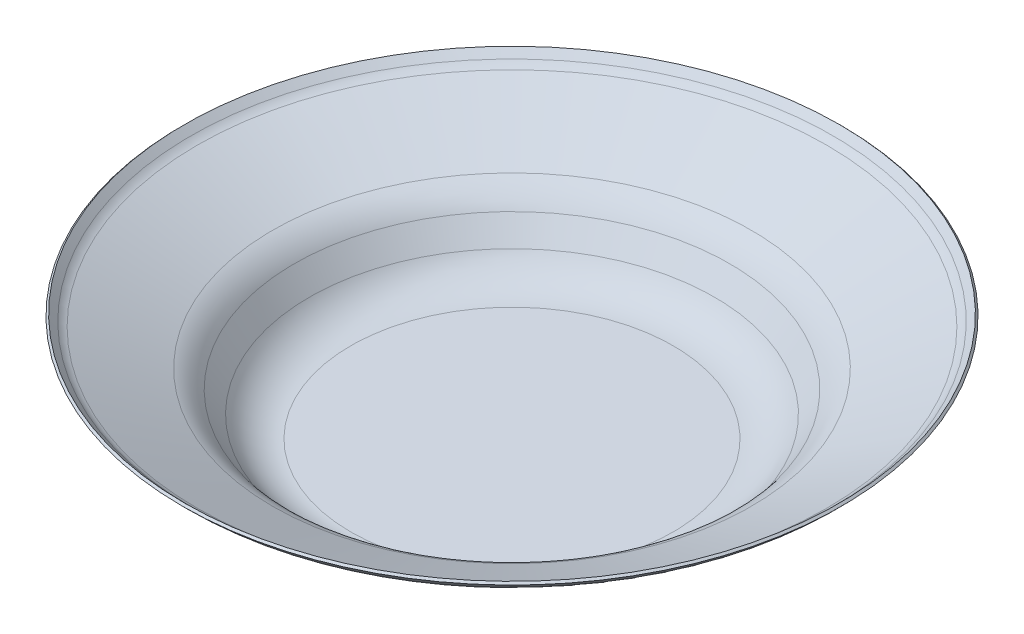
ISO-10303-21;
HEADER;
FILE_DESCRIPTION(('STEP AP214'),'2;1');
FILE_NAME('part.step','',(''),(''),'','','');
FILE_SCHEMA(('AUTOMOTIVE_DESIGN { 1 0 10303 214 1 1 1 1 }'));
ENDSEC;
DATA;
#1=APPLICATION_CONTEXT('core data for automotive mechanical design processes');
#2=APPLICATION_PROTOCOL_DEFINITION('international standard','automotive_design',2000,#1);
#3=PRODUCT_CONTEXT('',#1,'mechanical');
#4=PRODUCT('Part','Part','',(#3));
#5=PRODUCT_RELATED_PRODUCT_CATEGORY('part','',(#4));
#6=PRODUCT_DEFINITION_FORMATION('','',#4);
#7=PRODUCT_DEFINITION_CONTEXT('part definition',#1,'design');
#8=PRODUCT_DEFINITION('design','',#6,#7);
#9=PRODUCT_DEFINITION_SHAPE('','',#8);
#10=(LENGTH_UNIT() NAMED_UNIT(*) SI_UNIT(.MILLI.,.METRE.));
#11=(NAMED_UNIT(*) PLANE_ANGLE_UNIT() SI_UNIT($,.RADIAN.));
#12=(NAMED_UNIT(*) SI_UNIT($,.STERADIAN.) SOLID_ANGLE_UNIT());
#13=UNCERTAINTY_MEASURE_WITH_UNIT(LENGTH_MEASURE(1.E-05),#10,'distance_accuracy_value','');
#14=(GEOMETRIC_REPRESENTATION_CONTEXT(3) GLOBAL_UNCERTAINTY_ASSIGNED_CONTEXT((#13)) GLOBAL_UNIT_ASSIGNED_CONTEXT((#10,
#11,#12)) REPRESENTATION_CONTEXT('',''));
#15=CARTESIAN_POINT('',(0.,0.,0.));
#16=DIRECTION('',(0.,0.,1.));
#17=DIRECTION('',(1.,0.,0.));
#18=AXIS2_PLACEMENT_3D('',#15,#16,#17);
#19=CARTESIAN_POINT('',(0.,19.6440988052595,0.));
#20=DIRECTION('',(0.,1.,0.));
#21=DIRECTION('',(0.,0.,1.));
#22=AXIS2_PLACEMENT_3D('',#19,#20,#21);
#23=CONICAL_SURFACE('',#22,60.3915678494885,0.785398163397455);
#24=CARTESIAN_POINT('',(0.,20.8626191875281,0.));
#25=DIRECTION('',(0.,1.,0.));
#26=DIRECTION('',(0.,0.,1.));
#27=AXIS2_PLACEMENT_3D('',#24,#25,#26);
#28=CIRCLE('',#27,61.610088231757);
#29=CARTESIAN_POINT('',(0.,20.8626191875281,61.610088231757));
#30=VERTEX_POINT('',#29);
#31=EDGE_CURVE('E102',#30,#30,#28,.T.);
#32=ORIENTED_EDGE('',*,*,#31,.T.);
#33=EDGE_LOOP('',(#32));
#34=FACE_BOUND('',#33,.T.);
#35=CARTESIAN_POINT('',(0.,19.6440988052595,0.));
#36=DIRECTION('',(0.,1.,0.));
#37=DIRECTION('',(0.,0.,1.));
#38=AXIS2_PLACEMENT_3D('',#35,#36,#37);
#39=CIRCLE('',#38,60.3915678494885);
#40=CARTESIAN_POINT('',(0.,19.6440988052595,60.3915678494885));
#41=VERTEX_POINT('',#40);
#42=EDGE_CURVE('E10',#41,#41,#39,.T.);
#43=ORIENTED_EDGE('',*,*,#42,.F.);
#44=EDGE_LOOP('',(#43));
#45=FACE_BOUND('',#44,.T.);
#46=ADVANCED_FACE('F43',(#34,#45),#23,.F.);
#47=CARTESIAN_POINT('',(0.,22.826079320599,0.));
#48=DIRECTION('',(0.,1.,0.));
#49=DIRECTION('',(0.,0.,1.));
#50=AXIS2_PLACEMENT_3D('',#47,#48,#49);
#51=TOROIDAL_SURFACE('',#50,57.209587334149,4.5);
#52=ORIENTED_EDGE('',*,*,#42,.T.);
#53=EDGE_LOOP('',(#52));
#54=FACE_BOUND('',#53,.T.);
#55=CARTESIAN_POINT('',(0.,18.7664753232386,0.));
#56=DIRECTION('',(0.,1.,0.));
#57=DIRECTION('',(0.,0.,1.));
#58=AXIS2_PLACEMENT_3D('',#55,#56,#57);
#59=CIRCLE('',#58,59.151137072017);
#60=CARTESIAN_POINT('',(0.,18.7664753232386,59.151137072017));
#61=VERTEX_POINT('',#60);
#62=EDGE_CURVE('E50',#61,#61,#59,.T.);
#63=ORIENTED_EDGE('',*,*,#62,.F.);
#64=EDGE_LOOP('',(#63));
#65=FACE_BOUND('',#64,.T.);
#66=ADVANCED_FACE('F162',(#54,#65),#51,.F.);
#67=CARTESIAN_POINT('',(0.,11.991833453862,0.));
#68=DIRECTION('',(0.,1.,0.));
#69=DIRECTION('',(0.,0.,1.));
#70=AXIS2_PLACEMENT_3D('',#67,#68,#69);
#71=CONICAL_SURFACE('',#70,44.9859767996841,1.12469077785149);
#72=ORIENTED_EDGE('',*,*,#62,.T.);
#73=EDGE_LOOP('',(#72));
#74=FACE_BOUND('',#73,.T.);
#75=CARTESIAN_POINT('',(0.,11.991833453862,0.));
#76=DIRECTION('',(0.,1.,0.));
#77=DIRECTION('',(0.,0.,1.));
#78=AXIS2_PLACEMENT_3D('',#75,#76,#77);
#79=CIRCLE('',#78,44.9859767996841);
#80=CARTESIAN_POINT('',(0.,11.991833453862,44.9859767996841));
#81=VERTEX_POINT('',#80);
#82=EDGE_CURVE('E55',#81,#81,#79,.T.);
#83=ORIENTED_EDGE('',*,*,#82,.F.);
#84=EDGE_LOOP('',(#83));
#85=FACE_BOUND('',#84,.T.);
#86=ADVANCED_FACE('F166',(#74,#85),#71,.F.);
#87=CARTESIAN_POINT('',(0.,2.51942412668764,0.));
#88=DIRECTION('',(0.,1.,0.));
#89=DIRECTION('',(0.,0.,1.));
#90=AXIS2_PLACEMENT_3D('',#87,#88,#89);
#91=TOROIDAL_SURFACE('',#90,49.5162595213761,10.5);
#92=ORIENTED_EDGE('',*,*,#82,.T.);
#93=EDGE_LOOP('',(#92));
#94=FACE_BOUND('',#93,.T.);
#95=CARTESIAN_POINT('',(0.,8.56425963049396,0.));
#96=DIRECTION('',(0.,1.,0.));
#97=DIRECTION('',(0.,0.,1.));
#98=AXIS2_PLACEMENT_3D('',#95,#96,#97);
#99=CIRCLE('',#98,40.9308088208058);
#100=CARTESIAN_POINT('',(0.,8.56425963049396,40.9308088208058));
#101=VERTEX_POINT('',#100);
#102=EDGE_CURVE('E60',#101,#101,#99,.T.);
#103=ORIENTED_EDGE('',*,*,#102,.F.);
#104=EDGE_LOOP('',(#103));
#105=FACE_BOUND('',#104,.T.);
#106=ADVANCED_FACE('F170',(#94,#105),#91,.T.);
#107=CARTESIAN_POINT('',(0.,4.53086311560381,0.));
#108=DIRECTION('',(0.,1.,0.));
#109=DIRECTION('',(0.,0.,1.));
#110=AXIS2_PLACEMENT_3D('',#107,#108,#109);
#111=CONICAL_SURFACE('',#110,38.0909790547905,0.613458302345202);
#112=ORIENTED_EDGE('',*,*,#102,.T.);
#113=EDGE_LOOP('',(#112));
#114=FACE_BOUND('',#113,.T.);
#115=CARTESIAN_POINT('',(0.,4.53086311560381,0.));
#116=DIRECTION('',(0.,1.,0.));
#117=DIRECTION('',(0.,0.,1.));
#118=AXIS2_PLACEMENT_3D('',#115,#116,#117);
#119=CIRCLE('',#118,38.0909790547905);
#120=CARTESIAN_POINT('',(0.,4.53086311560381,38.0909790547905));
#121=VERTEX_POINT('',#120);
#122=EDGE_CURVE('E66',#121,#121,#119,.T.);
#123=ORIENTED_EDGE('',*,*,#122,.F.);
#124=EDGE_LOOP('',(#123));
#125=FACE_BOUND('',#124,.T.);
#126=ADVANCED_FACE('F176',(#114,#125),#111,.F.);
#127=CARTESIAN_POINT('',(0.,10.,0.));
#128=DIRECTION('',(0.,1.,0.));
#129=DIRECTION('',(0.,0.,1.));
#130=AXIS2_PLACEMENT_3D('',#127,#128,#129);
#131=TOROIDAL_SURFACE('',#130,30.3231903257031,9.5);
#132=ORIENTED_EDGE('',*,*,#122,.T.);
#133=EDGE_LOOP('',(#132));
#134=FACE_BOUND('',#133,.T.);
#135=CARTESIAN_POINT('',(0.,0.5,0.));
#136=DIRECTION('',(0.,1.,0.));
#137=DIRECTION('',(0.,0.,1.));
#138=AXIS2_PLACEMENT_3D('',#135,#136,#137);
#139=CIRCLE('',#138,30.323190325703);
#140=CARTESIAN_POINT('',(0.,0.5,30.323190325703));
#141=VERTEX_POINT('',#140);
#142=EDGE_CURVE('E70',#141,#141,#139,.T.);
#143=ORIENTED_EDGE('',*,*,#142,.F.);
#144=EDGE_LOOP('',(#143));
#145=FACE_BOUND('',#144,.T.);
#146=ADVANCED_FACE('F158',(#134,#145),#131,.F.);
#147=CARTESIAN_POINT('',(0.,0.500000000000001,0.));
#148=DIRECTION('',(0.,1.,0.));
#149=DIRECTION('',(0.,0.,1.));
#150=AXIS2_PLACEMENT_3D('',#147,#148,#149);
#151=PLANE('',#150);
#152=ORIENTED_EDGE('',*,*,#142,.T.);
#153=EDGE_LOOP('',(#152));
#154=FACE_BOUND('',#153,.T.);
#155=ADVANCED_FACE('F153',(#154),#151,.T.);
#156=CARTESIAN_POINT('',(0.,0.,0.));
#157=DIRECTION('',(0.,1.,0.));
#158=DIRECTION('',(0.,0.,1.));
#159=AXIS2_PLACEMENT_3D('',#156,#157,#158);
#160=PLANE('',#159);
#161=CARTESIAN_POINT('',(0.,0.,0.));
#162=DIRECTION('',(0.,1.,0.));
#163=DIRECTION('',(0.,0.,1.));
#164=AXIS2_PLACEMENT_3D('',#161,#162,#163);
#165=CIRCLE('',#164,30.323190325703);
#166=CARTESIAN_POINT('',(0.,0.,30.323190325703));
#167=VERTEX_POINT('',#166);
#168=EDGE_CURVE('E74',#167,#167,#165,.T.);
#169=ORIENTED_EDGE('',*,*,#168,.F.);
#170=EDGE_LOOP('',(#169));
#171=FACE_BOUND('',#170,.T.);
#172=ADVANCED_FACE('F148',(#171),#160,.F.);
#173=CARTESIAN_POINT('',(0.,10.,0.));
#174=DIRECTION('',(0.,1.,0.));
#175=DIRECTION('',(0.,0.,1.));
#176=AXIS2_PLACEMENT_3D('',#173,#174,#175);
#177=TOROIDAL_SURFACE('',#176,30.3231903257031,10.);
#178=CARTESIAN_POINT('',(0.,4.24301380589875,0.));
#179=DIRECTION('',(0.,1.,0.));
#180=DIRECTION('',(0.,0.,1.));
#181=AXIS2_PLACEMENT_3D('',#178,#179,#180);
#182=CIRCLE('',#181,38.4998100405319);
#183=CARTESIAN_POINT('',(0.,4.24301380589875,38.4998100405319));
#184=VERTEX_POINT('',#183);
#185=EDGE_CURVE('E78',#184,#184,#182,.T.);
#186=ORIENTED_EDGE('',*,*,#185,.F.);
#187=EDGE_LOOP('',(#186));
#188=FACE_BOUND('',#187,.T.);
#189=ORIENTED_EDGE('',*,*,#168,.T.);
#190=EDGE_LOOP('',(#189));
#191=FACE_BOUND('',#190,.T.);
#192=ADVANCED_FACE('F142',(#188,#191),#177,.T.);
#193=CARTESIAN_POINT('',(0.,4.24301380589875,0.));
#194=DIRECTION('',(0.,1.,0.));
#195=DIRECTION('',(0.,0.,1.));
#196=AXIS2_PLACEMENT_3D('',#193,#194,#195);
#197=CONICAL_SURFACE('',#196,38.4998100405319,0.613458302345202);
#198=CARTESIAN_POINT('',(0.,8.2764103207889,0.));
#199=DIRECTION('',(0.,1.,0.));
#200=DIRECTION('',(0.,0.,1.));
#201=AXIS2_PLACEMENT_3D('',#198,#199,#200);
#202=CIRCLE('',#201,41.3396398065473);
#203=CARTESIAN_POINT('',(0.,8.2764103207889,41.3396398065473));
#204=VERTEX_POINT('',#203);
#205=EDGE_CURVE('E82',#204,#204,#202,.T.);
#206=ORIENTED_EDGE('',*,*,#205,.F.);
#207=EDGE_LOOP('',(#206));
#208=FACE_BOUND('',#207,.T.);
#209=ORIENTED_EDGE('',*,*,#185,.T.);
#210=EDGE_LOOP('',(#209));
#211=FACE_BOUND('',#210,.T.);
#212=ADVANCED_FACE('F136',(#208,#211),#197,.T.);
#213=CARTESIAN_POINT('',(0.,2.51942412668764,0.));
#214=DIRECTION('',(0.,1.,0.));
#215=DIRECTION('',(0.,0.,1.));
#216=AXIS2_PLACEMENT_3D('',#213,#214,#215);
#217=TOROIDAL_SURFACE('',#216,49.5162595213761,10.);
#218=CARTESIAN_POINT('',(0.,11.5407663430441,0.));
#219=DIRECTION('',(0.,1.,0.));
#220=DIRECTION('',(0.,0.,1.));
#221=AXIS2_PLACEMENT_3D('',#218,#219,#220);
#222=CIRCLE('',#221,45.2017045483361);
#223=CARTESIAN_POINT('',(0.,11.5407663430441,45.2017045483361));
#224=VERTEX_POINT('',#223);
#225=EDGE_CURVE('E86',#224,#224,#222,.T.);
#226=ORIENTED_EDGE('',*,*,#225,.F.);
#227=EDGE_LOOP('',(#226));
#228=FACE_BOUND('',#227,.T.);
#229=ORIENTED_EDGE('',*,*,#205,.T.);
#230=EDGE_LOOP('',(#229));
#231=FACE_BOUND('',#230,.T.);
#232=ADVANCED_FACE('F130',(#228,#231),#217,.F.);
#233=CARTESIAN_POINT('',(0.,11.5407663430441,0.));
#234=DIRECTION('',(0.,1.,0.));
#235=DIRECTION('',(0.,0.,1.));
#236=AXIS2_PLACEMENT_3D('',#233,#234,#235);
#237=CONICAL_SURFACE('',#236,45.2017045483361,1.12469077785149);
#238=CARTESIAN_POINT('',(0.,18.3154082124207,0.));
#239=DIRECTION('',(0.,1.,0.));
#240=DIRECTION('',(0.,0.,1.));
#241=AXIS2_PLACEMENT_3D('',#238,#239,#240);
#242=CIRCLE('',#241,59.366864820669);
#243=CARTESIAN_POINT('',(0.,18.3154082124207,59.366864820669));
#244=VERTEX_POINT('',#243);
#245=EDGE_CURVE('E90',#244,#244,#242,.T.);
#246=ORIENTED_EDGE('',*,*,#245,.F.);
#247=EDGE_LOOP('',(#246));
#248=FACE_BOUND('',#247,.T.);
#249=ORIENTED_EDGE('',*,*,#225,.T.);
#250=EDGE_LOOP('',(#249));
#251=FACE_BOUND('',#250,.T.);
#252=ADVANCED_FACE('F124',(#248,#251),#237,.T.);
#253=CARTESIAN_POINT('',(0.,22.826079320599,0.));
#254=DIRECTION('',(0.,1.,0.));
#255=DIRECTION('',(0.,0.,1.));
#256=AXIS2_PLACEMENT_3D('',#253,#254,#255);
#257=TOROIDAL_SURFACE('',#256,57.209587334149,4.99999999999999);
#258=CARTESIAN_POINT('',(0.,19.2905454146662,0.));
#259=DIRECTION('',(0.,1.,0.));
#260=DIRECTION('',(0.,0.,1.));
#261=AXIS2_PLACEMENT_3D('',#258,#259,#260);
#262=CIRCLE('',#261,60.7451212400817);
#263=CARTESIAN_POINT('',(0.,19.2905454146662,60.7451212400817));
#264=VERTEX_POINT('',#263);
#265=EDGE_CURVE('E94',#264,#264,#262,.T.);
#266=ORIENTED_EDGE('',*,*,#265,.F.);
#267=EDGE_LOOP('',(#266));
#268=FACE_BOUND('',#267,.T.);
#269=ORIENTED_EDGE('',*,*,#245,.T.);
#270=EDGE_LOOP('',(#269));
#271=FACE_BOUND('',#270,.T.);
#272=ADVANCED_FACE('F118',(#268,#271),#257,.T.);
#273=CARTESIAN_POINT('',(0.,19.2905454146662,0.));
#274=DIRECTION('',(0.,1.,0.));
#275=DIRECTION('',(0.,0.,1.));
#276=AXIS2_PLACEMENT_3D('',#273,#274,#275);
#277=CONICAL_SURFACE('',#276,60.7451212400817,0.785398163397454);
#278=CARTESIAN_POINT('',(0.,20.5090657969348,0.));
#279=DIRECTION('',(0.,1.,0.));
#280=DIRECTION('',(0.,0.,1.));
#281=AXIS2_PLACEMENT_3D('',#278,#279,#280);
#282=CIRCLE('',#281,61.9636416223503);
#283=CARTESIAN_POINT('',(0.,20.5090657969348,61.9636416223503));
#284=VERTEX_POINT('',#283);
#285=EDGE_CURVE('E98',#284,#284,#282,.T.);
#286=ORIENTED_EDGE('',*,*,#285,.F.);
#287=EDGE_LOOP('',(#286));
#288=FACE_BOUND('',#287,.T.);
#289=ORIENTED_EDGE('',*,*,#265,.T.);
#290=EDGE_LOOP('',(#289));
#291=FACE_BOUND('',#290,.T.);
#292=ADVANCED_FACE('F112',(#288,#291),#277,.T.);
#293=CARTESIAN_POINT('',(0.,20.5090657969348,0.));
#294=DIRECTION('',(0.,-1.,0.));
#295=DIRECTION('',(0.,0.,-1.));
#296=AXIS2_PLACEMENT_3D('',#293,#294,#295);
#297=CONICAL_SURFACE('',#296,61.9636416223503,0.785398163397443);
#298=ORIENTED_EDGE('',*,*,#31,.F.);
#299=EDGE_LOOP('',(#298));
#300=FACE_BOUND('',#299,.T.);
#301=ORIENTED_EDGE('',*,*,#285,.T.);
#302=EDGE_LOOP('',(#301));
#303=FACE_BOUND('',#302,.T.);
#304=ADVANCED_FACE('F109',(#300,#303),#297,.T.);
#305=CLOSED_SHELL('',(#46,#66,#86,#106,#126,#146,#155,#172,#192,#212,#232,#252,#272,#292,#304));
#306=MANIFOLD_SOLID_BREP('B2',#305);
#307=ADVANCED_BREP_SHAPE_REPRESENTATION('',(#18,#306),#14);
#308=SHAPE_DEFINITION_REPRESENTATION(#9,#307);
ENDSEC;
END-ISO-10303-21;
